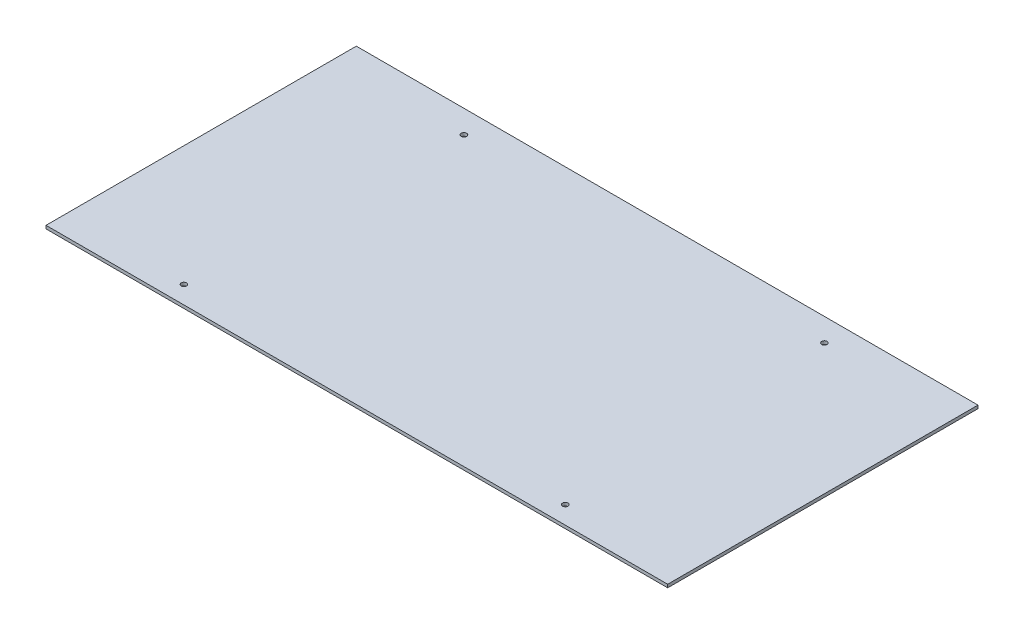
ISO-10303-21;
HEADER;
FILE_DESCRIPTION(('STEP AP214'),'2;1');
FILE_NAME('part.step','',(''),(''),'','','');
FILE_SCHEMA(('AUTOMOTIVE_DESIGN { 1 0 10303 214 1 1 1 1 }'));
ENDSEC;
DATA;
#1=APPLICATION_CONTEXT('core data for automotive mechanical design processes');
#2=APPLICATION_PROTOCOL_DEFINITION('international standard','automotive_design',2000,#1);
#3=PRODUCT_CONTEXT('',#1,'mechanical');
#4=PRODUCT('Part','Part','',(#3));
#5=PRODUCT_RELATED_PRODUCT_CATEGORY('part','',(#4));
#6=PRODUCT_DEFINITION_FORMATION('','',#4);
#7=PRODUCT_DEFINITION_CONTEXT('part definition',#1,'design');
#8=PRODUCT_DEFINITION('design','',#6,#7);
#9=PRODUCT_DEFINITION_SHAPE('','',#8);
#10=(LENGTH_UNIT() NAMED_UNIT(*) SI_UNIT(.MILLI.,.METRE.));
#11=(NAMED_UNIT(*) PLANE_ANGLE_UNIT() SI_UNIT($,.RADIAN.));
#12=(NAMED_UNIT(*) SI_UNIT($,.STERADIAN.) SOLID_ANGLE_UNIT());
#13=UNCERTAINTY_MEASURE_WITH_UNIT(LENGTH_MEASURE(1.E-05),#10,'distance_accuracy_value','');
#14=(GEOMETRIC_REPRESENTATION_CONTEXT(3) GLOBAL_UNCERTAINTY_ASSIGNED_CONTEXT((#13)) GLOBAL_UNIT_ASSIGNED_CONTEXT((#10,
#11,#12)) REPRESENTATION_CONTEXT('',''));
#15=CARTESIAN_POINT('',(0.,0.,0.));
#16=DIRECTION('',(0.,0.,1.));
#17=DIRECTION('',(1.,0.,0.));
#18=AXIS2_PLACEMENT_3D('',#15,#16,#17);
#19=CARTESIAN_POINT('',(297.5,3.,-148.5));
#20=DIRECTION('',(-1.,0.,0.));
#21=DIRECTION('',(0.,0.,1.));
#22=AXIS2_PLACEMENT_3D('',#19,#20,#21);
#23=PLANE('',#22);
#24=DIRECTION('',(0.,0.,-1.));
#25=VECTOR('',#24,1.);
#26=CARTESIAN_POINT('',(297.5,0.,-148.5));
#27=LINE('',#26,#25);
#28=CARTESIAN_POINT('',(297.5,0.,148.5));
#29=VERTEX_POINT('',#28);
#30=CARTESIAN_POINT('',(297.5,0.,-148.5));
#31=VERTEX_POINT('',#30);
#32=EDGE_CURVE('E111',#29,#31,#27,.T.);
#33=ORIENTED_EDGE('',*,*,#32,.T.);
#34=DIRECTION('',(0.,-1.,0.));
#35=VECTOR('',#34,1.);
#36=CARTESIAN_POINT('',(297.5,3.,-148.5));
#37=LINE('',#36,#35);
#38=CARTESIAN_POINT('',(297.5,3.,-148.5));
#39=VERTEX_POINT('',#38);
#40=EDGE_CURVE('E11',#39,#31,#37,.T.);
#41=ORIENTED_EDGE('',*,*,#40,.F.);
#42=DIRECTION('',(0.,0.,-1.));
#43=VECTOR('',#42,1.);
#44=CARTESIAN_POINT('',(297.5,3.,-148.5));
#45=LINE('',#44,#43);
#46=CARTESIAN_POINT('',(297.5,3.,148.5));
#47=VERTEX_POINT('',#46);
#48=EDGE_CURVE('E94',#47,#39,#45,.T.);
#49=ORIENTED_EDGE('',*,*,#48,.F.);
#50=DIRECTION('',(0.,-1.,0.));
#51=VECTOR('',#50,1.);
#52=CARTESIAN_POINT('',(297.5,3.,148.5));
#53=LINE('',#52,#51);
#54=EDGE_CURVE('E107',#47,#29,#53,.T.);
#55=ORIENTED_EDGE('',*,*,#54,.T.);
#56=EDGE_LOOP('',(#33,#41,#49,#55));
#57=FACE_BOUND('',#56,.T.);
#58=ADVANCED_FACE('F40',(#57),#23,.F.);
#59=CARTESIAN_POINT('',(-297.5,3.,-148.5));
#60=DIRECTION('',(0.,0.,1.));
#61=DIRECTION('',(1.,0.,0.));
#62=AXIS2_PLACEMENT_3D('',#59,#60,#61);
#63=PLANE('',#62);
#64=DIRECTION('',(-1.,0.,0.));
#65=VECTOR('',#64,1.);
#66=CARTESIAN_POINT('',(-297.5,0.,-148.5));
#67=LINE('',#66,#65);
#68=CARTESIAN_POINT('',(-297.5,0.,-148.5));
#69=VERTEX_POINT('',#68);
#70=EDGE_CURVE('E99',#31,#69,#67,.T.);
#71=ORIENTED_EDGE('',*,*,#70,.T.);
#72=DIRECTION('',(0.,-1.,0.));
#73=VECTOR('',#72,1.);
#74=CARTESIAN_POINT('',(-297.5,3.,-148.5));
#75=LINE('',#74,#73);
#76=CARTESIAN_POINT('',(-297.5,3.,-148.5));
#77=VERTEX_POINT('',#76);
#78=EDGE_CURVE('E50',#77,#69,#75,.T.);
#79=ORIENTED_EDGE('',*,*,#78,.F.);
#80=DIRECTION('',(-1.,0.,0.));
#81=VECTOR('',#80,1.);
#82=CARTESIAN_POINT('',(-297.5,3.,-148.5));
#83=LINE('',#82,#81);
#84=EDGE_CURVE('E89',#39,#77,#83,.T.);
#85=ORIENTED_EDGE('',*,*,#84,.F.);
#86=ORIENTED_EDGE('',*,*,#40,.T.);
#87=EDGE_LOOP('',(#71,#79,#85,#86));
#88=FACE_BOUND('',#87,.T.);
#89=ADVANCED_FACE('F98',(#88),#63,.F.);
#90=CARTESIAN_POINT('',(-297.5,3.,-148.5));
#91=DIRECTION('',(1.,0.,0.));
#92=DIRECTION('',(0.,0.,-1.));
#93=AXIS2_PLACEMENT_3D('',#90,#91,#92);
#94=PLANE('',#93);
#95=DIRECTION('',(0.,0.,1.));
#96=VECTOR('',#95,1.);
#97=CARTESIAN_POINT('',(-297.5,0.,-148.5));
#98=LINE('',#97,#96);
#99=CARTESIAN_POINT('',(-297.5,0.,148.5));
#100=VERTEX_POINT('',#99);
#101=EDGE_CURVE('E76',#69,#100,#98,.T.);
#102=ORIENTED_EDGE('',*,*,#101,.T.);
#103=DIRECTION('',(0.,-1.,0.));
#104=VECTOR('',#103,1.);
#105=CARTESIAN_POINT('',(-297.5,3.,148.5));
#106=LINE('',#105,#104);
#107=CARTESIAN_POINT('',(-297.5,3.,148.5));
#108=VERTEX_POINT('',#107);
#109=EDGE_CURVE('E101',#108,#100,#106,.T.);
#110=ORIENTED_EDGE('',*,*,#109,.F.);
#111=DIRECTION('',(0.,0.,1.));
#112=VECTOR('',#111,1.);
#113=CARTESIAN_POINT('',(-297.5,3.,-148.5));
#114=LINE('',#113,#112);
#115=EDGE_CURVE('E92',#77,#108,#114,.T.);
#116=ORIENTED_EDGE('',*,*,#115,.F.);
#117=ORIENTED_EDGE('',*,*,#78,.T.);
#118=EDGE_LOOP('',(#102,#110,#116,#117));
#119=FACE_BOUND('',#118,.T.);
#120=ADVANCED_FACE('F103',(#119),#94,.F.);
#121=CARTESIAN_POINT('',(-297.5,3.,148.5));
#122=DIRECTION('',(0.,0.,-1.));
#123=DIRECTION('',(-1.,0.,0.));
#124=AXIS2_PLACEMENT_3D('',#121,#122,#123);
#125=PLANE('',#124);
#126=DIRECTION('',(1.,0.,0.));
#127=VECTOR('',#126,1.);
#128=CARTESIAN_POINT('',(-297.5,0.,148.5));
#129=LINE('',#128,#127);
#130=EDGE_CURVE('E82',#100,#29,#129,.T.);
#131=ORIENTED_EDGE('',*,*,#130,.T.);
#132=ORIENTED_EDGE('',*,*,#54,.F.);
#133=DIRECTION('',(1.,0.,0.));
#134=VECTOR('',#133,1.);
#135=CARTESIAN_POINT('',(-297.5,3.,148.5));
#136=LINE('',#135,#134);
#137=EDGE_CURVE('E59',#108,#47,#136,.T.);
#138=ORIENTED_EDGE('',*,*,#137,.F.);
#139=ORIENTED_EDGE('',*,*,#109,.T.);
#140=EDGE_LOOP('',(#131,#132,#138,#139));
#141=FACE_BOUND('',#140,.T.);
#142=ADVANCED_FACE('F180',(#141),#125,.F.);
#143=CARTESIAN_POINT('',(0.,3.,0.));
#144=DIRECTION('',(0.,1.,0.));
#145=DIRECTION('',(0.,0.,1.));
#146=AXIS2_PLACEMENT_3D('',#143,#144,#145);
#147=PLANE('',#146);
#148=CARTESIAN_POINT('',(172.5,3.,-126.5));
#149=DIRECTION('',(0.,-1.,0.));
#150=DIRECTION('',(0.,0.,-1.));
#151=AXIS2_PLACEMENT_3D('',#148,#149,#150);
#152=CIRCLE('',#151,2.59999999999999);
#153=CARTESIAN_POINT('',(172.5,3.,-129.1));
#154=VERTEX_POINT('',#153);
#155=EDGE_CURVE('E140',#154,#154,#152,.T.);
#156=ORIENTED_EDGE('',*,*,#155,.T.);
#157=EDGE_LOOP('',(#156));
#158=FACE_BOUND('',#157,.T.);
#159=CARTESIAN_POINT('',(-172.5,3.,-126.5));
#160=DIRECTION('',(0.,-1.,0.));
#161=DIRECTION('',(0.,0.,-1.));
#162=AXIS2_PLACEMENT_3D('',#159,#160,#161);
#163=CIRCLE('',#162,2.59999999999999);
#164=CARTESIAN_POINT('',(-172.5,3.,-129.1));
#165=VERTEX_POINT('',#164);
#166=EDGE_CURVE('E148',#165,#165,#163,.T.);
#167=ORIENTED_EDGE('',*,*,#166,.T.);
#168=EDGE_LOOP('',(#167));
#169=FACE_BOUND('',#168,.T.);
#170=CARTESIAN_POINT('',(182.5,3.,131.5));
#171=DIRECTION('',(0.,-1.,0.));
#172=DIRECTION('',(0.,0.,-1.));
#173=AXIS2_PLACEMENT_3D('',#170,#171,#172);
#174=CIRCLE('',#173,2.59999999999999);
#175=CARTESIAN_POINT('',(182.5,3.,128.9));
#176=VERTEX_POINT('',#175);
#177=EDGE_CURVE('E127',#176,#176,#174,.T.);
#178=ORIENTED_EDGE('',*,*,#177,.T.);
#179=EDGE_LOOP('',(#178));
#180=FACE_BOUND('',#179,.T.);
#181=CARTESIAN_POINT('',(-182.5,3.,131.500000000002));
#182=DIRECTION('',(0.,-1.,0.));
#183=DIRECTION('',(0.,0.,-1.));
#184=AXIS2_PLACEMENT_3D('',#181,#182,#183);
#185=CIRCLE('',#184,2.59999999999999);
#186=CARTESIAN_POINT('',(-182.5,3.,128.900000000002));
#187=VERTEX_POINT('',#186);
#188=EDGE_CURVE('E134',#187,#187,#185,.T.);
#189=ORIENTED_EDGE('',*,*,#188,.T.);
#190=EDGE_LOOP('',(#189));
#191=FACE_BOUND('',#190,.T.);
#192=ORIENTED_EDGE('',*,*,#48,.T.);
#193=ORIENTED_EDGE('',*,*,#84,.T.);
#194=ORIENTED_EDGE('',*,*,#115,.T.);
#195=ORIENTED_EDGE('',*,*,#137,.T.);
#196=EDGE_LOOP('',(#192,#193,#194,#195));
#197=FACE_BOUND('',#196,.T.);
#198=ADVANCED_FACE('F90',(#158,#169,#180,#191,#197),#147,.T.);
#199=CARTESIAN_POINT('',(0.,0.,0.));
#200=DIRECTION('',(0.,1.,0.));
#201=DIRECTION('',(0.,0.,1.));
#202=AXIS2_PLACEMENT_3D('',#199,#200,#201);
#203=PLANE('',#202);
#204=CARTESIAN_POINT('',(172.5,0.,-126.5));
#205=DIRECTION('',(0.,-1.,0.));
#206=DIRECTION('',(0.,0.,-1.));
#207=AXIS2_PLACEMENT_3D('',#204,#205,#206);
#208=CIRCLE('',#207,2.59999999999999);
#209=CARTESIAN_POINT('',(172.5,0.,-129.1));
#210=VERTEX_POINT('',#209);
#211=EDGE_CURVE('E152',#210,#210,#208,.T.);
#212=ORIENTED_EDGE('',*,*,#211,.F.);
#213=EDGE_LOOP('',(#212));
#214=FACE_BOUND('',#213,.T.);
#215=CARTESIAN_POINT('',(-172.5,0.,-126.5));
#216=DIRECTION('',(0.,-1.,0.));
#217=DIRECTION('',(0.,0.,-1.));
#218=AXIS2_PLACEMENT_3D('',#215,#216,#217);
#219=CIRCLE('',#218,2.59999999999999);
#220=CARTESIAN_POINT('',(-172.5,0.,-129.1));
#221=VERTEX_POINT('',#220);
#222=EDGE_CURVE('E143',#221,#221,#219,.T.);
#223=ORIENTED_EDGE('',*,*,#222,.F.);
#224=EDGE_LOOP('',(#223));
#225=FACE_BOUND('',#224,.T.);
#226=CARTESIAN_POINT('',(182.5,0.,131.5));
#227=DIRECTION('',(0.,1.,0.));
#228=DIRECTION('',(0.,0.,1.));
#229=AXIS2_PLACEMENT_3D('',#226,#227,#228);
#230=CIRCLE('',#229,2.59999999999999);
#231=CARTESIAN_POINT('',(182.5,0.,134.1));
#232=VERTEX_POINT('',#231);
#233=EDGE_CURVE('E43',#232,#232,#230,.T.);
#234=ORIENTED_EDGE('',*,*,#233,.T.);
#235=EDGE_LOOP('',(#234));
#236=FACE_BOUND('',#235,.T.);
#237=CARTESIAN_POINT('',(-182.5,0.,131.500000000002));
#238=DIRECTION('',(0.,1.,0.));
#239=DIRECTION('',(0.,0.,1.));
#240=AXIS2_PLACEMENT_3D('',#237,#238,#239);
#241=CIRCLE('',#240,2.59999999999999);
#242=CARTESIAN_POINT('',(-182.5,0.,134.100000000002));
#243=VERTEX_POINT('',#242);
#244=EDGE_CURVE('E124',#243,#243,#241,.T.);
#245=ORIENTED_EDGE('',*,*,#244,.T.);
#246=EDGE_LOOP('',(#245));
#247=FACE_BOUND('',#246,.T.);
#248=ORIENTED_EDGE('',*,*,#32,.F.);
#249=ORIENTED_EDGE('',*,*,#130,.F.);
#250=ORIENTED_EDGE('',*,*,#101,.F.);
#251=ORIENTED_EDGE('',*,*,#70,.F.);
#252=EDGE_LOOP('',(#248,#249,#250,#251));
#253=FACE_BOUND('',#252,.T.);
#254=ADVANCED_FACE('F169',(#214,#225,#236,#247,#253),#203,.F.);
#255=CARTESIAN_POINT('',(-182.5,3.,131.500000000002));
#256=DIRECTION('',(0.,-1.,0.));
#257=DIRECTION('',(0.,0.,-1.));
#258=AXIS2_PLACEMENT_3D('',#255,#256,#257);
#259=CYLINDRICAL_SURFACE('',#258,2.59999999999999);
#260=ORIENTED_EDGE('',*,*,#188,.F.);
#261=EDGE_LOOP('',(#260));
#262=FACE_BOUND('',#261,.T.);
#263=ORIENTED_EDGE('',*,*,#244,.F.);
#264=EDGE_LOOP('',(#263));
#265=FACE_BOUND('',#264,.T.);
#266=ADVANCED_FACE('F172',(#262,#265),#259,.F.);
#267=CARTESIAN_POINT('',(182.5,3.,131.5));
#268=DIRECTION('',(0.,-1.,0.));
#269=DIRECTION('',(0.,0.,-1.));
#270=AXIS2_PLACEMENT_3D('',#267,#268,#269);
#271=CYLINDRICAL_SURFACE('',#270,2.59999999999999);
#272=ORIENTED_EDGE('',*,*,#177,.F.);
#273=EDGE_LOOP('',(#272));
#274=FACE_BOUND('',#273,.T.);
#275=ORIENTED_EDGE('',*,*,#233,.F.);
#276=EDGE_LOOP('',(#275));
#277=FACE_BOUND('',#276,.T.);
#278=ADVANCED_FACE('F214',(#274,#277),#271,.F.);
#279=CARTESIAN_POINT('',(-172.5,3.,-126.5));
#280=DIRECTION('',(0.,-1.,0.));
#281=DIRECTION('',(0.,0.,-1.));
#282=AXIS2_PLACEMENT_3D('',#279,#280,#281);
#283=CYLINDRICAL_SURFACE('',#282,2.59999999999999);
#284=ORIENTED_EDGE('',*,*,#166,.F.);
#285=EDGE_LOOP('',(#284));
#286=FACE_BOUND('',#285,.T.);
#287=ORIENTED_EDGE('',*,*,#222,.T.);
#288=EDGE_LOOP('',(#287));
#289=FACE_BOUND('',#288,.T.);
#290=ADVANCED_FACE('F165',(#286,#289),#283,.F.);
#291=CARTESIAN_POINT('',(172.5,3.,-126.5));
#292=DIRECTION('',(0.,-1.,0.));
#293=DIRECTION('',(0.,0.,-1.));
#294=AXIS2_PLACEMENT_3D('',#291,#292,#293);
#295=CYLINDRICAL_SURFACE('',#294,2.59999999999999);
#296=ORIENTED_EDGE('',*,*,#155,.F.);
#297=EDGE_LOOP('',(#296));
#298=FACE_BOUND('',#297,.T.);
#299=ORIENTED_EDGE('',*,*,#211,.T.);
#300=EDGE_LOOP('',(#299));
#301=FACE_BOUND('',#300,.T.);
#302=ADVANCED_FACE('F162',(#298,#301),#295,.F.);
#303=CLOSED_SHELL('',(#58,#89,#120,#142,#198,#254,#266,#278,#290,#302));
#304=MANIFOLD_SOLID_BREP('B2',#303);
#305=ADVANCED_BREP_SHAPE_REPRESENTATION('',(#18,#304),#14);
#306=SHAPE_DEFINITION_REPRESENTATION(#9,#305);
ENDSEC;
END-ISO-10303-21;
